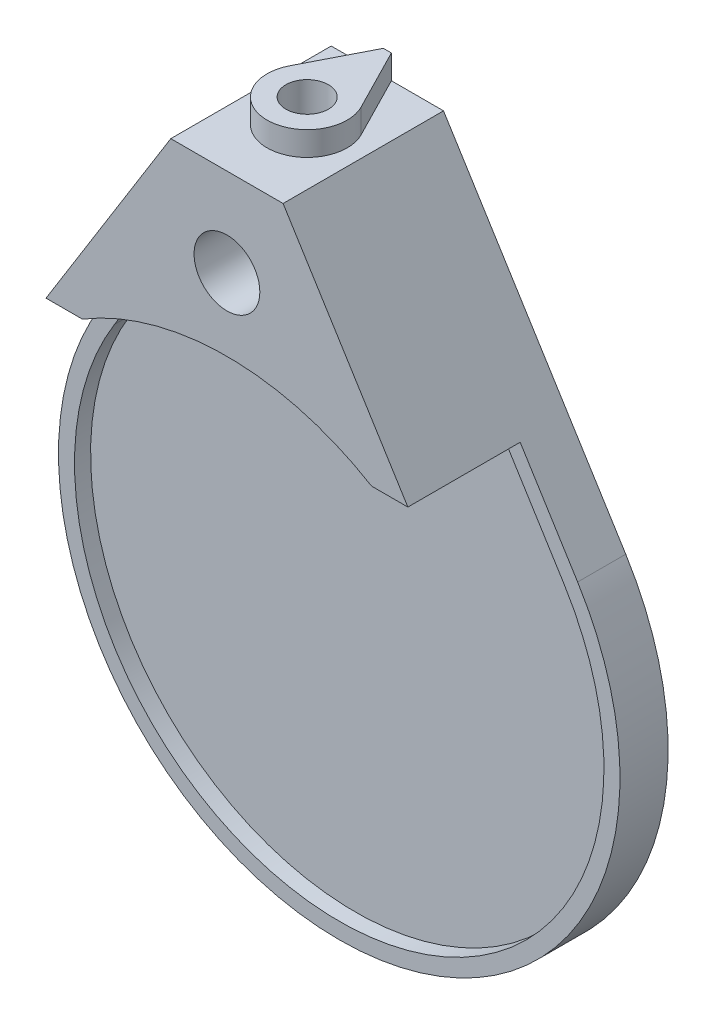
ISO-10303-21;
HEADER;
FILE_DESCRIPTION(('STEP AP214'),'2;1');
FILE_NAME('part.step','',(''),(''),'','','');
FILE_SCHEMA(('AUTOMOTIVE_DESIGN { 1 0 10303 214 1 1 1 1 }'));
ENDSEC;
DATA;
#1=APPLICATION_CONTEXT('core data for automotive mechanical design processes');
#2=APPLICATION_PROTOCOL_DEFINITION('international standard','automotive_design',2000,#1);
#3=PRODUCT_CONTEXT('',#1,'mechanical');
#4=PRODUCT('Part','Part','',(#3));
#5=PRODUCT_RELATED_PRODUCT_CATEGORY('part','',(#4));
#6=PRODUCT_DEFINITION_FORMATION('','',#4);
#7=PRODUCT_DEFINITION_CONTEXT('part definition',#1,'design');
#8=PRODUCT_DEFINITION('design','',#6,#7);
#9=PRODUCT_DEFINITION_SHAPE('','',#8);
#10=(LENGTH_UNIT() NAMED_UNIT(*) SI_UNIT(.MILLI.,.METRE.));
#11=(NAMED_UNIT(*) PLANE_ANGLE_UNIT() SI_UNIT($,.RADIAN.));
#12=(NAMED_UNIT(*) SI_UNIT($,.STERADIAN.) SOLID_ANGLE_UNIT());
#13=UNCERTAINTY_MEASURE_WITH_UNIT(LENGTH_MEASURE(1.E-05),#10,'distance_accuracy_value','');
#14=(GEOMETRIC_REPRESENTATION_CONTEXT(3) GLOBAL_UNCERTAINTY_ASSIGNED_CONTEXT((#13)) GLOBAL_UNIT_ASSIGNED_CONTEXT((#10,
#11,#12)) REPRESENTATION_CONTEXT('',''));
#15=CARTESIAN_POINT('',(0.,0.,0.));
#16=DIRECTION('',(0.,0.,1.));
#17=DIRECTION('',(1.,0.,0.));
#18=AXIS2_PLACEMENT_3D('',#15,#16,#17);
#19=CARTESIAN_POINT('',(0.,0.,4.));
#20=DIRECTION('',(0.,0.,1.));
#21=DIRECTION('',(1.,0.,0.));
#22=AXIS2_PLACEMENT_3D('',#19,#20,#21);
#23=PLANE('',#22);
#24=CARTESIAN_POINT('',(0.,0.,4.));
#25=DIRECTION('',(0.,0.,-1.));
#26=DIRECTION('',(1.,0.,0.));
#27=AXIS2_PLACEMENT_3D('',#24,#25,#26);
#28=CIRCLE('',#27,33.);
#29=CARTESIAN_POINT('',(28.0188679245283,17.433962264151,4.));
#30=VERTEX_POINT('',#29);
#31=CARTESIAN_POINT('',(-28.0188679245283,17.433962264151,4.));
#32=VERTEX_POINT('',#31);
#33=EDGE_CURVE('E183',#30,#32,#28,.T.);
#34=ORIENTED_EDGE('',*,*,#33,.F.);
#35=DIRECTION('',(0.528301886792454,-0.849056603773584,0.));
#36=VECTOR('',#35,1.);
#37=CARTESIAN_POINT('',(28.0188679245283,17.433962264151,4.));
#38=LINE('',#37,#36);
#39=CARTESIAN_POINT('',(20.2,30.,4.));
#40=VERTEX_POINT('',#39);
#41=EDGE_CURVE('E178',#40,#30,#38,.T.);
#42=ORIENTED_EDGE('',*,*,#41,.F.);
#43=DIRECTION('',(-1.,0.,0.));
#44=VECTOR('',#43,1.);
#45=CARTESIAN_POINT('',(-35.,30.,4.));
#46=LINE('',#45,#44);
#47=CARTESIAN_POINT('',(18.02775637732,30.,4.));
#48=VERTEX_POINT('',#47);
#49=EDGE_CURVE('E248',#40,#48,#46,.T.);
#50=ORIENTED_EDGE('',*,*,#49,.T.);
#51=CARTESIAN_POINT('',(0.,0.,4.));
#52=DIRECTION('',(0.,0.,-1.));
#53=DIRECTION('',(1.,0.,0.));
#54=AXIS2_PLACEMENT_3D('',#51,#52,#53);
#55=CIRCLE('',#54,35.);
#56=CARTESIAN_POINT('',(-18.02775637732,30.,4.));
#57=VERTEX_POINT('',#56);
#58=EDGE_CURVE('E263',#57,#48,#55,.T.);
#59=ORIENTED_EDGE('',*,*,#58,.F.);
#60=CARTESIAN_POINT('',(-20.2,30.,4.));
#61=VERTEX_POINT('',#60);
#62=EDGE_CURVE('E242',#57,#61,#46,.T.);
#63=ORIENTED_EDGE('',*,*,#62,.T.);
#64=DIRECTION('',(0.528301886792453,0.849056603773585,0.));
#65=VECTOR('',#64,1.);
#66=CARTESIAN_POINT('',(-20.8574423480084,28.9433962264151,4.));
#67=LINE('',#66,#65);
#68=EDGE_CURVE('E194',#32,#61,#67,.T.);
#69=ORIENTED_EDGE('',*,*,#68,.F.);
#70=EDGE_LOOP('',(#34,#42,#50,#59,#63,#69));
#71=FACE_BOUND('',#70,.T.);
#72=ADVANCED_FACE('F41',(#71),#23,.T.);
#73=CARTESIAN_POINT('',(-35.,30.,20.));
#74=DIRECTION('',(0.,-1.,0.));
#75=DIRECTION('',(0.,0.,-1.));
#76=AXIS2_PLACEMENT_3D('',#73,#74,#75);
#77=PLANE('',#76);
#78=DIRECTION('',(-1.,0.,0.));
#79=VECTOR('',#78,1.);
#80=CARTESIAN_POINT('',(-20.2,30.,6.));
#81=LINE('',#80,#79);
#82=CARTESIAN_POINT('',(-20.2,30.,6.));
#83=VERTEX_POINT('',#82);
#84=CARTESIAN_POINT('',(-22.5555555555556,30.,6.));
#85=VERTEX_POINT('',#84);
#86=EDGE_CURVE('E193',#83,#85,#81,.T.);
#87=ORIENTED_EDGE('',*,*,#86,.F.);
#88=DIRECTION('',(0.,0.,-1.));
#89=VECTOR('',#88,1.);
#90=CARTESIAN_POINT('',(-20.2,30.,6.));
#91=LINE('',#90,#89);
#92=EDGE_CURVE('E239',#83,#61,#91,.T.);
#93=ORIENTED_EDGE('',*,*,#92,.T.);
#94=ORIENTED_EDGE('',*,*,#62,.F.);
#95=DIRECTION('',(0.,0.,-1.));
#96=VECTOR('',#95,1.);
#97=CARTESIAN_POINT('',(-18.02775637732,30.,20.));
#98=LINE('',#97,#96);
#99=CARTESIAN_POINT('',(-18.02775637732,30.,20.));
#100=VERTEX_POINT('',#99);
#101=EDGE_CURVE('E11',#57,#100,#98,.F.);
#102=ORIENTED_EDGE('',*,*,#101,.T.);
#103=DIRECTION('',(-1.,0.,0.));
#104=VECTOR('',#103,1.);
#105=CARTESIAN_POINT('',(-35.,30.,20.));
#106=LINE('',#105,#104);
#107=CARTESIAN_POINT('',(-22.5555555555556,30.,20.));
#108=VERTEX_POINT('',#107);
#109=EDGE_CURVE('E243',#100,#108,#106,.T.);
#110=ORIENTED_EDGE('',*,*,#109,.T.);
#111=DIRECTION('',(0.,0.,1.));
#112=VECTOR('',#111,1.);
#113=CARTESIAN_POINT('',(-22.5555555555556,30.,0.));
#114=LINE('',#113,#112);
#115=EDGE_CURVE('E256',#85,#108,#114,.T.);
#116=ORIENTED_EDGE('',*,*,#115,.F.);
#117=EDGE_LOOP('',(#87,#93,#94,#102,#110,#116));
#118=FACE_BOUND('',#117,.T.);
#119=ADVANCED_FACE('F354',(#118),#77,.T.);
#120=ORIENTED_EDGE('',*,*,#49,.F.);
#121=DIRECTION('',(0.,0.,-1.));
#122=VECTOR('',#121,1.);
#123=CARTESIAN_POINT('',(20.2,30.,6.));
#124=LINE('',#123,#122);
#125=CARTESIAN_POINT('',(20.2,30.,6.));
#126=VERTEX_POINT('',#125);
#127=EDGE_CURVE('E235',#126,#40,#124,.T.);
#128=ORIENTED_EDGE('',*,*,#127,.F.);
#129=DIRECTION('',(-1.,0.,0.));
#130=VECTOR('',#129,1.);
#131=CARTESIAN_POINT('',(20.2,30.,6.));
#132=LINE('',#131,#130);
#133=CARTESIAN_POINT('',(22.5555555555556,30.,6.));
#134=VERTEX_POINT('',#133);
#135=EDGE_CURVE('E210',#134,#126,#132,.T.);
#136=ORIENTED_EDGE('',*,*,#135,.F.);
#137=DIRECTION('',(0.,0.,-1.));
#138=VECTOR('',#137,1.);
#139=CARTESIAN_POINT('',(22.5555555555556,30.,0.));
#140=LINE('',#139,#138);
#141=CARTESIAN_POINT('',(22.5555555555556,30.,20.));
#142=VERTEX_POINT('',#141);
#143=EDGE_CURVE('E252',#142,#134,#140,.T.);
#144=ORIENTED_EDGE('',*,*,#143,.F.);
#145=CARTESIAN_POINT('',(18.02775637732,30.,20.));
#146=VERTEX_POINT('',#145);
#147=EDGE_CURVE('E247',#142,#146,#106,.T.);
#148=ORIENTED_EDGE('',*,*,#147,.T.);
#149=DIRECTION('',(0.,0.,-1.));
#150=VECTOR('',#149,1.);
#151=CARTESIAN_POINT('',(18.02775637732,30.,20.));
#152=LINE('',#151,#150);
#153=EDGE_CURVE('E50',#146,#48,#152,.T.);
#154=ORIENTED_EDGE('',*,*,#153,.T.);
#155=EDGE_LOOP('',(#120,#128,#136,#144,#148,#154));
#156=FACE_BOUND('',#155,.T.);
#157=ADVANCED_FACE('F318',(#156),#77,.T.);
#158=CARTESIAN_POINT('',(-7.,55.,0.));
#159=DIRECTION('',(-0.849056603773585,0.528301886792453,0.));
#160=DIRECTION('',(-0.528301886792453,-0.849056603773585,0.));
#161=AXIS2_PLACEMENT_3D('',#158,#159,#160);
#162=PLANE('',#161);
#163=DIRECTION('',(0.,0.,1.));
#164=VECTOR('',#163,1.);
#165=CARTESIAN_POINT('',(-29.7169811320755,18.4905660377359,0.));
#166=LINE('',#165,#164);
#167=CARTESIAN_POINT('',(-29.7169811320755,18.4905660377359,0.));
#168=VERTEX_POINT('',#167);
#169=CARTESIAN_POINT('',(-29.7169811320755,18.4905660377359,6.));
#170=VERTEX_POINT('',#169);
#171=EDGE_CURVE('E299',#168,#170,#166,.T.);
#172=ORIENTED_EDGE('',*,*,#171,.T.);
#173=DIRECTION('',(-0.528301886792453,-0.849056603773585,0.));
#174=VECTOR('',#173,1.);
#175=CARTESIAN_POINT('',(-22.5555555555556,30.,6.));
#176=LINE('',#175,#174);
#177=EDGE_CURVE('E198',#85,#170,#176,.T.);
#178=ORIENTED_EDGE('',*,*,#177,.F.);
#179=ORIENTED_EDGE('',*,*,#115,.T.);
#180=DIRECTION('',(-0.528301886792453,-0.849056603773584,0.));
#181=VECTOR('',#180,1.);
#182=CARTESIAN_POINT('',(-7.,55.,20.));
#183=LINE('',#182,#181);
#184=CARTESIAN_POINT('',(-7.,55.,20.));
#185=VERTEX_POINT('',#184);
#186=EDGE_CURVE('E275',#185,#108,#183,.T.);
#187=ORIENTED_EDGE('',*,*,#186,.F.);
#188=DIRECTION('',(0.,0.,1.));
#189=VECTOR('',#188,1.);
#190=CARTESIAN_POINT('',(-7.,55.,0.));
#191=LINE('',#190,#189);
#192=CARTESIAN_POINT('',(-7.,55.,0.));
#193=VERTEX_POINT('',#192);
#194=EDGE_CURVE('E303',#193,#185,#191,.T.);
#195=ORIENTED_EDGE('',*,*,#194,.F.);
#196=DIRECTION('',(-0.528301886792453,-0.849056603773584,0.));
#197=VECTOR('',#196,1.);
#198=CARTESIAN_POINT('',(-7.,55.,0.));
#199=LINE('',#198,#197);
#200=EDGE_CURVE('E294',#193,#168,#199,.T.);
#201=ORIENTED_EDGE('',*,*,#200,.T.);
#202=EDGE_LOOP('',(#172,#178,#179,#187,#195,#201));
#203=FACE_BOUND('',#202,.T.);
#204=ADVANCED_FACE('F339',(#203),#162,.T.);
#205=CARTESIAN_POINT('',(29.7169811320755,18.4905660377359,0.));
#206=DIRECTION('',(0.849056603773585,0.528301886792453,0.));
#207=DIRECTION('',(-0.528301886792453,0.849056603773585,0.));
#208=AXIS2_PLACEMENT_3D('',#205,#206,#207);
#209=PLANE('',#208);
#210=DIRECTION('',(-0.528301886792453,0.849056603773584,0.));
#211=VECTOR('',#210,1.);
#212=CARTESIAN_POINT('',(29.7169811320755,18.4905660377359,20.));
#213=LINE('',#212,#211);
#214=CARTESIAN_POINT('',(7.,55.,20.));
#215=VERTEX_POINT('',#214);
#216=EDGE_CURVE('E268',#142,#215,#213,.T.);
#217=ORIENTED_EDGE('',*,*,#216,.F.);
#218=ORIENTED_EDGE('',*,*,#143,.T.);
#219=DIRECTION('',(-0.528301886792454,0.849056603773584,0.));
#220=VECTOR('',#219,1.);
#221=CARTESIAN_POINT('',(29.7169811320755,18.4905660377359,6.));
#222=LINE('',#221,#220);
#223=CARTESIAN_POINT('',(29.7169811320755,18.4905660377359,6.));
#224=VERTEX_POINT('',#223);
#225=EDGE_CURVE('E206',#224,#134,#222,.T.);
#226=ORIENTED_EDGE('',*,*,#225,.F.);
#227=DIRECTION('',(0.,0.,1.));
#228=VECTOR('',#227,1.);
#229=CARTESIAN_POINT('',(29.7169811320755,18.4905660377359,0.));
#230=LINE('',#229,#228);
#231=CARTESIAN_POINT('',(29.7169811320755,18.4905660377359,0.));
#232=VERTEX_POINT('',#231);
#233=EDGE_CURVE('E298',#232,#224,#230,.T.);
#234=ORIENTED_EDGE('',*,*,#233,.F.);
#235=DIRECTION('',(-0.528301886792453,0.849056603773584,0.));
#236=VECTOR('',#235,1.);
#237=CARTESIAN_POINT('',(29.7169811320755,18.4905660377359,0.));
#238=LINE('',#237,#236);
#239=CARTESIAN_POINT('',(7.,55.,0.));
#240=VERTEX_POINT('',#239);
#241=EDGE_CURVE('E286',#232,#240,#238,.T.);
#242=ORIENTED_EDGE('',*,*,#241,.T.);
#243=DIRECTION('',(0.,0.,1.));
#244=VECTOR('',#243,1.);
#245=CARTESIAN_POINT('',(7.,55.,0.));
#246=LINE('',#245,#244);
#247=EDGE_CURVE('E306',#240,#215,#246,.T.);
#248=ORIENTED_EDGE('',*,*,#247,.T.);
#249=EDGE_LOOP('',(#217,#218,#226,#234,#242,#248));
#250=FACE_BOUND('',#249,.T.);
#251=ADVANCED_FACE('F360',(#250),#209,.T.);
#252=CARTESIAN_POINT('',(0.,0.,20.));
#253=DIRECTION('',(0.,0.,1.));
#254=DIRECTION('',(1.,0.,0.));
#255=AXIS2_PLACEMENT_3D('',#252,#253,#254);
#256=PLANE('',#255);
#257=CARTESIAN_POINT('',(0.,44.,20.));
#258=DIRECTION('',(0.,0.,1.));
#259=DIRECTION('',(1.,0.,0.));
#260=AXIS2_PLACEMENT_3D('',#257,#258,#259);
#261=CIRCLE('',#260,4.1);
#262=CARTESIAN_POINT('',(4.1,44.,20.));
#263=VERTEX_POINT('',#262);
#264=EDGE_CURVE('E259',#263,#263,#261,.T.);
#265=ORIENTED_EDGE('',*,*,#264,.F.);
#266=EDGE_LOOP('',(#265));
#267=FACE_BOUND('',#266,.T.);
#268=ORIENTED_EDGE('',*,*,#186,.T.);
#269=ORIENTED_EDGE('',*,*,#109,.F.);
#270=CARTESIAN_POINT('',(0.,0.,20.));
#271=DIRECTION('',(0.,0.,-1.));
#272=DIRECTION('',(1.,0.,0.));
#273=AXIS2_PLACEMENT_3D('',#270,#271,#272);
#274=CIRCLE('',#273,35.);
#275=EDGE_CURVE('E264',#100,#146,#274,.T.);
#276=ORIENTED_EDGE('',*,*,#275,.T.);
#277=ORIENTED_EDGE('',*,*,#147,.F.);
#278=ORIENTED_EDGE('',*,*,#216,.T.);
#279=DIRECTION('',(-1.,0.,0.));
#280=VECTOR('',#279,1.);
#281=CARTESIAN_POINT('',(7.,55.,20.));
#282=LINE('',#281,#280);
#283=EDGE_CURVE('E271',#215,#185,#282,.T.);
#284=ORIENTED_EDGE('',*,*,#283,.T.);
#285=EDGE_LOOP('',(#268,#269,#276,#277,#278,#284));
#286=FACE_BOUND('',#285,.T.);
#287=ADVANCED_FACE('F357',(#267,#286),#256,.T.);
#288=CARTESIAN_POINT('',(0.,0.,20.));
#289=DIRECTION('',(0.,0.,-1.));
#290=DIRECTION('',(-1.,0.,0.));
#291=AXIS2_PLACEMENT_3D('',#288,#289,#290);
#292=CYLINDRICAL_SURFACE('',#291,35.);
#293=ORIENTED_EDGE('',*,*,#101,.F.);
#294=ORIENTED_EDGE('',*,*,#58,.T.);
#295=ORIENTED_EDGE('',*,*,#153,.F.);
#296=ORIENTED_EDGE('',*,*,#275,.F.);
#297=EDGE_LOOP('',(#293,#294,#295,#296));
#298=FACE_BOUND('',#297,.T.);
#299=ADVANCED_FACE('F324',(#298),#292,.F.);
#300=CARTESIAN_POINT('',(0.,0.,4.));
#301=DIRECTION('',(0.,0.,-1.));
#302=DIRECTION('',(-1.,0.,0.));
#303=AXIS2_PLACEMENT_3D('',#300,#301,#302);
#304=CYLINDRICAL_SURFACE('',#303,35.);
#305=ORIENTED_EDGE('',*,*,#233,.T.);
#306=CARTESIAN_POINT('',(0.,0.,6.));
#307=DIRECTION('',(0.,0.,1.));
#308=DIRECTION('',(1.,0.,0.));
#309=AXIS2_PLACEMENT_3D('',#306,#307,#308);
#310=CIRCLE('',#309,35.);
#311=EDGE_CURVE('E202',#170,#224,#310,.T.);
#312=ORIENTED_EDGE('',*,*,#311,.F.);
#313=ORIENTED_EDGE('',*,*,#171,.F.);
#314=CARTESIAN_POINT('',(0.,0.,0.));
#315=DIRECTION('',(0.,0.,1.));
#316=DIRECTION('',(1.,0.,0.));
#317=AXIS2_PLACEMENT_3D('',#314,#315,#316);
#318=CIRCLE('',#317,35.);
#319=EDGE_CURVE('E302',#168,#232,#318,.T.);
#320=ORIENTED_EDGE('',*,*,#319,.T.);
#321=EDGE_LOOP('',(#305,#312,#313,#320));
#322=FACE_BOUND('',#321,.T.);
#323=ADVANCED_FACE('F43',(#322),#304,.T.);
#324=CARTESIAN_POINT('',(0.,0.,0.));
#325=DIRECTION('',(0.,0.,1.));
#326=DIRECTION('',(1.,0.,0.));
#327=AXIS2_PLACEMENT_3D('',#324,#325,#326);
#328=PLANE('',#327);
#329=ORIENTED_EDGE('',*,*,#319,.F.);
#330=ORIENTED_EDGE('',*,*,#200,.F.);
#331=DIRECTION('',(-1.,0.,0.));
#332=VECTOR('',#331,1.);
#333=CARTESIAN_POINT('',(7.,55.,0.));
#334=LINE('',#333,#332);
#335=CARTESIAN_POINT('',(-0.500000000000001,55.,0.));
#336=VERTEX_POINT('',#335);
#337=EDGE_CURVE('E290',#336,#193,#334,.T.);
#338=ORIENTED_EDGE('',*,*,#337,.F.);
#339=DIRECTION('',(0.,-1.,0.));
#340=VECTOR('',#339,1.);
#341=CARTESIAN_POINT('',(-0.5,58.,0.));
#342=LINE('',#341,#340);
#343=CARTESIAN_POINT('',(-0.5,58.,0.));
#344=VERTEX_POINT('',#343);
#345=EDGE_CURVE('E185',#344,#336,#342,.T.);
#346=ORIENTED_EDGE('',*,*,#345,.F.);
#347=DIRECTION('',(-1.,0.,0.));
#348=VECTOR('',#347,1.);
#349=CARTESIAN_POINT('',(-0.5,58.,0.));
#350=LINE('',#349,#348);
#351=CARTESIAN_POINT('',(0.5,58.,0.));
#352=VERTEX_POINT('',#351);
#353=EDGE_CURVE('E162',#352,#344,#350,.T.);
#354=ORIENTED_EDGE('',*,*,#353,.F.);
#355=DIRECTION('',(0.,-1.,0.));
#356=VECTOR('',#355,1.);
#357=CARTESIAN_POINT('',(0.5,58.,0.));
#358=LINE('',#357,#356);
#359=CARTESIAN_POINT('',(0.5,55.,0.));
#360=VERTEX_POINT('',#359);
#361=EDGE_CURVE('E158',#352,#360,#358,.T.);
#362=ORIENTED_EDGE('',*,*,#361,.T.);
#363=EDGE_CURVE('E291',#240,#360,#334,.T.);
#364=ORIENTED_EDGE('',*,*,#363,.F.);
#365=ORIENTED_EDGE('',*,*,#241,.F.);
#366=EDGE_LOOP('',(#329,#330,#338,#346,#354,#362,#364,#365));
#367=FACE_BOUND('',#366,.T.);
#368=CARTESIAN_POINT('',(0.,44.,0.));
#369=DIRECTION('',(0.,0.,1.));
#370=DIRECTION('',(1.,0.,0.));
#371=AXIS2_PLACEMENT_3D('',#368,#369,#370);
#372=CIRCLE('',#371,4.1);
#373=CARTESIAN_POINT('',(4.1,44.,0.));
#374=VERTEX_POINT('',#373);
#375=EDGE_CURVE('E279',#374,#374,#372,.T.);
#376=ORIENTED_EDGE('',*,*,#375,.T.);
#377=EDGE_LOOP('',(#376));
#378=FACE_BOUND('',#377,.T.);
#379=ADVANCED_FACE('F340',(#367,#378),#328,.F.);
#380=CARTESIAN_POINT('',(7.,55.,0.));
#381=DIRECTION('',(0.,1.,0.));
#382=DIRECTION('',(0.,0.,1.));
#383=AXIS2_PLACEMENT_3D('',#380,#381,#382);
#384=PLANE('',#383);
#385=DIRECTION('',(-0.45548790131447,0.,0.890241973710597));
#386=VECTOR('',#385,1.);
#387=CARTESIAN_POINT('',(-4.45120986855298,55.,7.72256049342765));
#388=LINE('',#387,#386);
#389=CARTESIAN_POINT('',(-4.45120986855298,55.,7.72256049342765));
#390=VERTEX_POINT('',#389);
#391=EDGE_CURVE('E174',#336,#390,#388,.T.);
#392=ORIENTED_EDGE('',*,*,#391,.F.);
#393=ORIENTED_EDGE('',*,*,#337,.T.);
#394=ORIENTED_EDGE('',*,*,#194,.T.);
#395=ORIENTED_EDGE('',*,*,#283,.F.);
#396=ORIENTED_EDGE('',*,*,#247,.F.);
#397=ORIENTED_EDGE('',*,*,#363,.T.);
#398=DIRECTION('',(-0.45548790131447,0.,-0.890241973710597));
#399=VECTOR('',#398,1.);
#400=CARTESIAN_POINT('',(0.5,55.,0.));
#401=LINE('',#400,#399);
#402=CARTESIAN_POINT('',(4.45120986855299,55.,7.72256049342765));
#403=VERTEX_POINT('',#402);
#404=EDGE_CURVE('E62',#403,#360,#401,.T.);
#405=ORIENTED_EDGE('',*,*,#404,.F.);
#406=CARTESIAN_POINT('',(0.,55.,10.));
#407=DIRECTION('',(0.,1.,0.));
#408=DIRECTION('',(0.,0.,1.));
#409=AXIS2_PLACEMENT_3D('',#406,#407,#408);
#410=CIRCLE('',#409,5.);
#411=EDGE_CURVE('E57',#390,#403,#410,.T.);
#412=ORIENTED_EDGE('',*,*,#411,.F.);
#413=EDGE_LOOP('',(#392,#393,#394,#395,#396,#397,#405,#412));
#414=FACE_BOUND('',#413,.T.);
#415=ADVANCED_FACE('F331',(#414),#384,.T.);
#416=CARTESIAN_POINT('',(0.,44.,0.));
#417=DIRECTION('',(0.,0.,1.));
#418=DIRECTION('',(1.,0.,0.));
#419=AXIS2_PLACEMENT_3D('',#416,#417,#418);
#420=CYLINDRICAL_SURFACE('',#419,4.1);
#421=CARTESIAN_POINT('',(0.,48.1,12.65));
#422=CARTESIAN_POINT('',(0.133900989611,48.0999930076451,12.6499925319742));
#423=CARTESIAN_POINT('',(0.267870360417253,48.0933778514751,12.6397894448691));
#424=CARTESIAN_POINT('',(0.531592100486459,48.0675571363336,12.5995673719671));
#425=CARTESIAN_POINT('',(0.661340292026737,48.0483394799884,12.5695293460519));
#426=CARTESIAN_POINT('',(0.912388565675493,47.9992301981543,12.4914367443663));
#427=CARTESIAN_POINT('',(1.0337254743132,47.9693891446457,12.4434674758789));
#428=CARTESIAN_POINT('',(1.26618010737267,47.9014706761576,12.3315125574113));
#429=CARTESIAN_POINT('',(1.37729707616267,47.8633926528577,12.2675257244399));
#430=CARTESIAN_POINT('',(1.59650759025187,47.7783723319612,12.1195686322296));
#431=CARTESIAN_POINT('',(1.70359541747856,47.7309579007929,12.0343852525743));
#432=CARTESIAN_POINT('',(1.90292967614903,47.633346332054,11.8492955810967));
#433=CARTESIAN_POINT('',(1.99515519969364,47.5831454056205,11.749368920641));
#434=CARTESIAN_POINT('',(2.17595735235316,47.4767425743543,11.5205276555464));
#435=CARTESIAN_POINT('',(2.26201229130904,47.4207411556873,11.3895110478985));
#436=CARTESIAN_POINT('',(2.41069900512918,47.3176391440795,11.1116425759199));
#437=CARTESIAN_POINT('',(2.47337112266645,47.2705232908916,10.9648185537527));
#438=CARTESIAN_POINT('',(2.5584674554012,47.2041103665791,10.7002810256812));
#439=CARTESIAN_POINT('',(2.5872169956085,47.1807273530075,10.5856366993464));
#440=CARTESIAN_POINT('',(2.62921519108053,47.1461071769675,10.3518255011127));
#441=CARTESIAN_POINT('',(2.64248813300509,47.1348509865925,10.2326660188937));
#442=CARTESIAN_POINT('',(2.65271707251253,47.126203389549,9.99272686231337));
#443=CARTESIAN_POINT('',(2.649619086962,47.1288578530222,9.87194313933709));
#444=CARTESIAN_POINT('',(2.62720272377074,47.1476978542872,9.6329289843257));
#445=CARTESIAN_POINT('',(2.60787083825264,47.1638946603209,9.51470076272751));
#446=CARTESIAN_POINT('',(2.55506676755783,47.2066687609897,9.28776474071634));
#447=CARTESIAN_POINT('',(2.52208160936023,47.2328863478858,9.17887159015894));
#448=CARTESIAN_POINT('',(2.44339299175185,47.2927601345027,8.96800618030606));
#449=CARTESIAN_POINT('',(2.39768533349885,47.326418789264,8.86603621973449));
#450=CARTESIAN_POINT('',(2.28458020362944,47.4053369995612,8.65064693733928));
#451=CARTESIAN_POINT('',(2.21468763520235,47.4515773855987,8.53889929866321));
#452=CARTESIAN_POINT('',(2.05967364186556,47.5462676907148,8.32743899024341));
#453=CARTESIAN_POINT('',(1.97453394394402,47.5947202084439,8.22774100428167));
#454=CARTESIAN_POINT('',(1.77247326518324,47.6991348719673,8.02385200126377));
#455=CARTESIAN_POINT('',(1.65258731915731,47.7547759622807,7.9224025730903));
#456=CARTESIAN_POINT('',(1.39446603513004,47.8580727796539,7.74107047544631));
#457=CARTESIAN_POINT('',(1.25625006223355,47.9057368156472,7.66116531167996));
#458=CARTESIAN_POINT('',(0.993384653764902,47.9796950809477,7.53986021975697));
#459=CARTESIAN_POINT('',(0.871474209593281,48.0083523064519,7.49396776820056));
#460=CARTESIAN_POINT('',(0.620331080573519,48.0548057005069,7.42031526843308));
#461=CARTESIAN_POINT('',(0.491104457502964,48.0726107207286,7.39254044116331));
#462=CARTESIAN_POINT('',(0.228352158001574,48.0957662495891,7.35651846711606));
#463=CARTESIAN_POINT('',(0.0948128401500646,48.1010722892187,7.34834104240469));
#464=CARTESIAN_POINT('',(-0.171854500572207,48.0985657870841,7.35221893223671));
#465=CARTESIAN_POINT('',(-0.3049825103703,48.0907528325677,7.3642748833661));
#466=CARTESIAN_POINT('',(-0.559119307961454,48.0635945264065,7.4066350716552));
#467=CARTESIAN_POINT('',(-0.680386185030417,48.0449326088617,7.43585887603903));
#468=CARTESIAN_POINT('',(-0.915960419510839,47.9981810620583,7.51026364994168));
#469=CARTESIAN_POINT('',(-1.03026660867691,47.9700898553611,7.55544728946906));
#470=CARTESIAN_POINT('',(-1.2577101255725,47.9042500945576,7.66383739489893));
#471=CARTESIAN_POINT('',(-1.37018256375036,47.8659556322185,7.72809948857373));
#472=CARTESIAN_POINT('',(-1.58325119036624,47.7836998563802,7.87107910026692));
#473=CARTESIAN_POINT('',(-1.6838385174257,47.7397343650875,7.94980729366004));
#474=CARTESIAN_POINT('',(-1.88662752398719,47.6421372383157,8.1332858022238));
#475=CARTESIAN_POINT('',(-1.98668098966032,47.5880611972544,8.2401770760606));
#476=CARTESIAN_POINT('',(-2.16823941852042,47.4813543657501,8.46943747517));
#477=CARTESIAN_POINT('',(-2.24973878766136,47.4287240153761,8.59181125115015));
#478=CARTESIAN_POINT('',(-2.38334780763247,47.3369707386529,8.83430973253709));
#479=CARTESIAN_POINT('',(-2.43786671566795,47.2969814353063,8.9527748962873));
#480=CARTESIAN_POINT('',(-2.5294965372274,47.2272274986523,9.19917138524797));
#481=CARTESIAN_POINT('',(-2.56663087421884,47.1974491220055,9.32708970274436));
#482=CARTESIAN_POINT('',(-2.60787876839136,47.1637440732602,9.52452313167738));
#483=CARTESIAN_POINT('',(-2.61924173253107,47.1543143780026,9.5916590010405));
#484=CARTESIAN_POINT('',(-2.63678669851211,47.1396641044309,9.7270443366969));
#485=CARTESIAN_POINT('',(-2.64297149782961,47.1344412534493,9.79529318136652));
#486=CARTESIAN_POINT('',(-2.65001961552194,47.1284849853738,9.9322273223297));
#487=CARTESIAN_POINT('',(-2.65088575372996,47.1277491893468,10.0009123680193));
#488=CARTESIAN_POINT('',(-2.64729295813745,47.1307891660969,10.1380204783323));
#489=CARTESIAN_POINT('',(-2.64283452792326,47.1345645122198,10.206443567117));
#490=CARTESIAN_POINT('',(-2.62379217670458,47.1505533421682,10.3892323407904));
#491=CARTESIAN_POINT('',(-2.60434964629953,47.1667873751565,10.5027868929571));
#492=CARTESIAN_POINT('',(-2.55157722266942,47.2094511768042,10.7245754150856));
#493=CARTESIAN_POINT('',(-2.51823315664464,47.2358913487124,10.8328038287173));
#494=CARTESIAN_POINT('',(-2.42531916845325,47.3063997738739,11.0784180689508));
#495=CARTESIAN_POINT('',(-2.3606745134905,47.3534034573828,11.2130426317532));
#496=CARTESIAN_POINT('',(-2.21120402416489,47.453793222315,11.4679882942114));
#497=CARTESIAN_POINT('',(-2.12634720460555,47.5071890397278,11.5882870034373));
#498=CARTESIAN_POINT('',(-1.93690818925181,47.6153075697362,11.8146468850205));
#499=CARTESIAN_POINT('',(-1.83207788814092,47.6700384806386,11.9204966513169));
#500=CARTESIAN_POINT('',(-1.60487671360382,47.7749157247676,12.1140222960442));
#501=CARTESIAN_POINT('',(-1.48252220259316,47.8250662639551,12.201714943098));
#502=CARTESIAN_POINT('',(-1.23804577030825,47.9104873760816,12.3467851033296));
#503=CARTESIAN_POINT('',(-1.11772389806682,47.9468275120118,12.4065580358415));
#504=CARTESIAN_POINT('',(-0.867170731715702,48.0093143637867,12.5077266020021));
#505=CARTESIAN_POINT('',(-0.736954784693807,48.0354764963178,12.5491500430427));
#506=CARTESIAN_POINT('',(-0.505320554231608,48.0699542155364,12.6033305024077));
#507=CARTESIAN_POINT('',(-0.405407049784228,48.0811610823929,12.6207737812121));
#508=CARTESIAN_POINT('',(-0.203675608560713,48.0961867954537,12.6441116226016));
#509=CARTESIAN_POINT('',(-0.101857588817805,48.1000053190377,12.6500056808774));
#510=CARTESIAN_POINT('',(0.,48.1,12.65));
#511=B_SPLINE_CURVE_WITH_KNOTS('',3,(#421,#422,#423,#424,#425,#426,#427,#428,#429,#430,#431,
#432,#433,#434,#435,#436,#437,#438,#439,#440,#441,#442,#443,#444,#445,#446,#447,#448,#449,#450,
#451,#452,#453,#454,#455,#456,#457,#458,#459,#460,#461,#462,#463,#464,#465,#466,#467,#468,#469,
#470,#471,#472,#473,#474,#475,#476,#477,#478,#479,#480,#481,#482,#483,#484,#485,#486,#487,#488,
#489,#490,#491,#492,#493,#494,#495,#496,#497,#498,#499,#500,#501,#502,#503,#504,#505,#506,#507,
#508,#509,#510),.UNSPECIFIED.,.T.,.F.,(4,2,2,2,2,2,2,2,2,2,2,2,2,2,2,2,2,2,2,2,2,2,2,2,2,2,2,2,
2,2,2,2,2,2,2,2,2,2,2,2,2,2,2,2,4),(0.,0.401291046616277,0.80296786492565,1.20275754942676,
1.60257676945879,2.03538099587673,2.46878886288228,2.9658005530844,3.46195073337674,
3.82193862699423,4.18136084590432,4.54196899764098,4.90287750128487,5.25189136711555,
5.60102055582196,6.01856045602997,6.43660414959731,6.93402814862112,7.43093075982427,
7.82936767369574,8.22747916350659,8.62700493339975,9.02654327347816,9.40328531418998,
9.78009041202374,10.1837714721239,10.58775163713,11.0540999235577,11.5205886279802,
11.9282978224194,12.3354560889519,12.5413958412197,12.7472242637022,12.9529435512066,
13.15864338376,13.5060010315704,13.853713684474,14.3209173243084,14.78884184874,
15.2630103499732,15.7367389702532,16.1525560651516,16.5677408439011,16.872986935266,
17.1782463552394),.UNSPECIFIED.);
#512=CARTESIAN_POINT('',(0.,48.1,12.65));
#513=VERTEX_POINT('',#512);
#514=EDGE_CURVE('E408',#513,#513,#511,.T.);
#515=ORIENTED_EDGE('',*,*,#514,.T.);
#516=EDGE_LOOP('',(#515));
#517=FACE_BOUND('',#516,.T.);
#518=ORIENTED_EDGE('',*,*,#375,.F.);
#519=EDGE_LOOP('',(#518));
#520=FACE_BOUND('',#519,.T.);
#521=ORIENTED_EDGE('',*,*,#264,.T.);
#522=EDGE_LOOP('',(#521));
#523=FACE_BOUND('',#522,.T.);
#524=ADVANCED_FACE('F392',(#517,#520,#523),#420,.F.);
#525=CARTESIAN_POINT('',(28.0188679245283,17.433962264151,6.));
#526=DIRECTION('',(0.849056603773584,0.528301886792454,0.));
#527=DIRECTION('',(-0.528301886792454,0.849056603773584,0.));
#528=AXIS2_PLACEMENT_3D('',#525,#526,#527);
#529=PLANE('',#528);
#530=ORIENTED_EDGE('',*,*,#41,.T.);
#531=DIRECTION('',(0.,0.,-1.));
#532=VECTOR('',#531,1.);
#533=CARTESIAN_POINT('',(28.0188679245283,17.433962264151,6.));
#534=LINE('',#533,#532);
#535=CARTESIAN_POINT('',(28.0188679245283,17.433962264151,6.));
#536=VERTEX_POINT('',#535);
#537=EDGE_CURVE('E231',#536,#30,#534,.T.);
#538=ORIENTED_EDGE('',*,*,#537,.F.);
#539=DIRECTION('',(0.528301886792457,-0.849056603773582,0.));
#540=VECTOR('',#539,1.);
#541=CARTESIAN_POINT('',(20.8574423480084,28.9433962264151,6.));
#542=LINE('',#541,#540);
#543=EDGE_CURVE('E214',#126,#536,#542,.T.);
#544=ORIENTED_EDGE('',*,*,#543,.F.);
#545=ORIENTED_EDGE('',*,*,#127,.T.);
#546=EDGE_LOOP('',(#530,#538,#544,#545));
#547=FACE_BOUND('',#546,.T.);
#548=ADVANCED_FACE('F364',(#547),#529,.F.);
#549=CARTESIAN_POINT('',(0.,0.,6.));
#550=DIRECTION('',(0.,0.,-1.));
#551=DIRECTION('',(-1.,0.,0.));
#552=AXIS2_PLACEMENT_3D('',#549,#550,#551);
#553=CYLINDRICAL_SURFACE('',#552,33.);
#554=ORIENTED_EDGE('',*,*,#33,.T.);
#555=DIRECTION('',(0.,0.,-1.));
#556=VECTOR('',#555,1.);
#557=CARTESIAN_POINT('',(-28.0188679245283,17.433962264151,6.));
#558=LINE('',#557,#556);
#559=CARTESIAN_POINT('',(-28.0188679245283,17.433962264151,6.));
#560=VERTEX_POINT('',#559);
#561=EDGE_CURVE('E220',#560,#32,#558,.T.);
#562=ORIENTED_EDGE('',*,*,#561,.F.);
#563=CARTESIAN_POINT('',(0.,0.,6.));
#564=DIRECTION('',(0.,0.,-1.));
#565=DIRECTION('',(1.,0.,0.));
#566=AXIS2_PLACEMENT_3D('',#563,#564,#565);
#567=CIRCLE('',#566,33.);
#568=EDGE_CURVE('E217',#536,#560,#567,.T.);
#569=ORIENTED_EDGE('',*,*,#568,.F.);
#570=ORIENTED_EDGE('',*,*,#537,.T.);
#571=EDGE_LOOP('',(#554,#562,#569,#570));
#572=FACE_BOUND('',#571,.T.);
#573=ADVANCED_FACE('F368',(#572),#553,.F.);
#574=CARTESIAN_POINT('',(-20.8574423480084,28.9433962264151,6.));
#575=DIRECTION('',(-0.849056603773584,0.528301886792453,0.));
#576=DIRECTION('',(-0.528301886792453,-0.849056603773585,0.));
#577=AXIS2_PLACEMENT_3D('',#574,#575,#576);
#578=PLANE('',#577);
#579=ORIENTED_EDGE('',*,*,#68,.T.);
#580=ORIENTED_EDGE('',*,*,#92,.F.);
#581=DIRECTION('',(0.528301886792456,0.849056603773583,0.));
#582=VECTOR('',#581,1.);
#583=CARTESIAN_POINT('',(-20.8574423480084,28.9433962264151,6.));
#584=LINE('',#583,#582);
#585=EDGE_CURVE('E189',#560,#83,#584,.T.);
#586=ORIENTED_EDGE('',*,*,#585,.F.);
#587=ORIENTED_EDGE('',*,*,#561,.T.);
#588=EDGE_LOOP('',(#579,#580,#586,#587));
#589=FACE_BOUND('',#588,.T.);
#590=ADVANCED_FACE('F370',(#589),#578,.F.);
#591=CARTESIAN_POINT('',(0.,0.,6.));
#592=DIRECTION('',(0.,0.,1.));
#593=DIRECTION('',(1.,0.,0.));
#594=AXIS2_PLACEMENT_3D('',#591,#592,#593);
#595=PLANE('',#594);
#596=ORIENTED_EDGE('',*,*,#585,.T.);
#597=ORIENTED_EDGE('',*,*,#86,.T.);
#598=ORIENTED_EDGE('',*,*,#177,.T.);
#599=ORIENTED_EDGE('',*,*,#311,.T.);
#600=ORIENTED_EDGE('',*,*,#225,.T.);
#601=ORIENTED_EDGE('',*,*,#135,.T.);
#602=ORIENTED_EDGE('',*,*,#543,.T.);
#603=ORIENTED_EDGE('',*,*,#568,.T.);
#604=EDGE_LOOP('',(#596,#597,#598,#599,#600,#601,#602,#603));
#605=FACE_BOUND('',#604,.T.);
#606=ADVANCED_FACE('F350',(#605),#595,.T.);
#607=CARTESIAN_POINT('',(0.,58.,10.));
#608=DIRECTION('',(0.,1.,0.));
#609=DIRECTION('',(0.,0.,1.));
#610=AXIS2_PLACEMENT_3D('',#607,#608,#609);
#611=PLANE('',#610);
#612=CARTESIAN_POINT('',(0.,58.,10.));
#613=DIRECTION('',(0.,1.,0.));
#614=DIRECTION('',(0.,0.,1.));
#615=AXIS2_PLACEMENT_3D('',#612,#613,#614);
#616=CIRCLE('',#615,5.);
#617=CARTESIAN_POINT('',(-4.45120986855298,58.,7.72256049342765));
#618=VERTEX_POINT('',#617);
#619=CARTESIAN_POINT('',(4.45120986855299,58.,7.72256049342765));
#620=VERTEX_POINT('',#619);
#621=EDGE_CURVE('E163',#618,#620,#616,.T.);
#622=ORIENTED_EDGE('',*,*,#621,.T.);
#623=DIRECTION('',(-0.45548790131447,0.,-0.890241973710597));
#624=VECTOR('',#623,1.);
#625=CARTESIAN_POINT('',(0.5,58.,0.));
#626=LINE('',#625,#624);
#627=EDGE_CURVE('E152',#620,#352,#626,.T.);
#628=ORIENTED_EDGE('',*,*,#627,.T.);
#629=ORIENTED_EDGE('',*,*,#353,.T.);
#630=DIRECTION('',(-0.45548790131447,0.,0.890241973710597));
#631=VECTOR('',#630,1.);
#632=CARTESIAN_POINT('',(-4.45120986855298,58.,7.72256049342765));
#633=LINE('',#632,#631);
#634=EDGE_CURVE('E169',#344,#618,#633,.T.);
#635=ORIENTED_EDGE('',*,*,#634,.T.);
#636=EDGE_LOOP('',(#622,#628,#629,#635));
#637=FACE_BOUND('',#636,.T.);
#638=CARTESIAN_POINT('',(0.,58.,10.));
#639=DIRECTION('',(0.,1.,0.));
#640=DIRECTION('',(0.,0.,1.));
#641=AXIS2_PLACEMENT_3D('',#638,#639,#640);
#642=CIRCLE('',#641,2.65);
#643=CARTESIAN_POINT('',(0.,58.,12.65));
#644=VERTEX_POINT('',#643);
#645=EDGE_CURVE('E416',#644,#644,#642,.T.);
#646=ORIENTED_EDGE('',*,*,#645,.F.);
#647=EDGE_LOOP('',(#646));
#648=FACE_BOUND('',#647,.T.);
#649=ADVANCED_FACE('F166',(#637,#648),#611,.T.);
#650=CARTESIAN_POINT('',(0.,58.,10.));
#651=DIRECTION('',(0.,-1.,0.));
#652=DIRECTION('',(0.,0.,-1.));
#653=AXIS2_PLACEMENT_3D('',#650,#651,#652);
#654=CYLINDRICAL_SURFACE('',#653,5.);
#655=ORIENTED_EDGE('',*,*,#411,.T.);
#656=DIRECTION('',(0.,-1.,0.));
#657=VECTOR('',#656,1.);
#658=CARTESIAN_POINT('',(4.45120986855299,58.,7.72256049342765));
#659=LINE('',#658,#657);
#660=EDGE_CURVE('E156',#620,#403,#659,.T.);
#661=ORIENTED_EDGE('',*,*,#660,.F.);
#662=ORIENTED_EDGE('',*,*,#621,.F.);
#663=DIRECTION('',(0.,-1.,0.));
#664=VECTOR('',#663,1.);
#665=CARTESIAN_POINT('',(-4.45120986855298,58.,7.72256049342765));
#666=LINE('',#665,#664);
#667=EDGE_CURVE('E591',#618,#390,#666,.T.);
#668=ORIENTED_EDGE('',*,*,#667,.T.);
#669=EDGE_LOOP('',(#655,#661,#662,#668));
#670=FACE_BOUND('',#669,.T.);
#671=ADVANCED_FACE('F176',(#670),#654,.T.);
#672=CARTESIAN_POINT('',(0.5,58.,0.));
#673=DIRECTION('',(-0.890241973710597,0.,0.45548790131447));
#674=DIRECTION('',(0.45548790131447,0.,0.890241973710597));
#675=AXIS2_PLACEMENT_3D('',#672,#673,#674);
#676=PLANE('',#675);
#677=ORIENTED_EDGE('',*,*,#404,.T.);
#678=ORIENTED_EDGE('',*,*,#361,.F.);
#679=ORIENTED_EDGE('',*,*,#627,.F.);
#680=ORIENTED_EDGE('',*,*,#660,.T.);
#681=EDGE_LOOP('',(#677,#678,#679,#680));
#682=FACE_BOUND('',#681,.T.);
#683=ADVANCED_FACE('F154',(#682),#676,.F.);
#684=CARTESIAN_POINT('',(-4.45120986855298,58.,7.72256049342765));
#685=DIRECTION('',(0.890241973710597,0.,0.45548790131447));
#686=DIRECTION('',(0.45548790131447,0.,-0.890241973710597));
#687=AXIS2_PLACEMENT_3D('',#684,#685,#686);
#688=PLANE('',#687);
#689=ORIENTED_EDGE('',*,*,#391,.T.);
#690=ORIENTED_EDGE('',*,*,#667,.F.);
#691=ORIENTED_EDGE('',*,*,#634,.F.);
#692=ORIENTED_EDGE('',*,*,#345,.T.);
#693=EDGE_LOOP('',(#689,#690,#691,#692));
#694=FACE_BOUND('',#693,.T.);
#695=ADVANCED_FACE('F422',(#694),#688,.F.);
#696=CARTESIAN_POINT('',(0.,58.,10.));
#697=DIRECTION('',(0.,-1.,0.));
#698=DIRECTION('',(0.,0.,-1.));
#699=AXIS2_PLACEMENT_3D('',#696,#697,#698);
#700=CYLINDRICAL_SURFACE('',#699,2.65);
#701=ORIENTED_EDGE('',*,*,#645,.T.);
#702=EDGE_LOOP('',(#701));
#703=FACE_BOUND('',#702,.T.);
#704=ORIENTED_EDGE('',*,*,#514,.F.);
#705=EDGE_LOOP('',(#704));
#706=FACE_BOUND('',#705,.T.);
#707=ADVANCED_FACE('F419',(#703,#706),#700,.F.);
#708=CLOSED_SHELL('',(#72,#119,#157,#204,#251,#287,#299,#323,#379,#415,#524,#548,#573,#590,#606,
#649,#671,#683,#695,#707));
#709=MANIFOLD_SOLID_BREP('B2',#708);
#710=ADVANCED_BREP_SHAPE_REPRESENTATION('',(#18,#709),#14);
#711=SHAPE_DEFINITION_REPRESENTATION(#9,#710);
ENDSEC;
END-ISO-10303-21;
